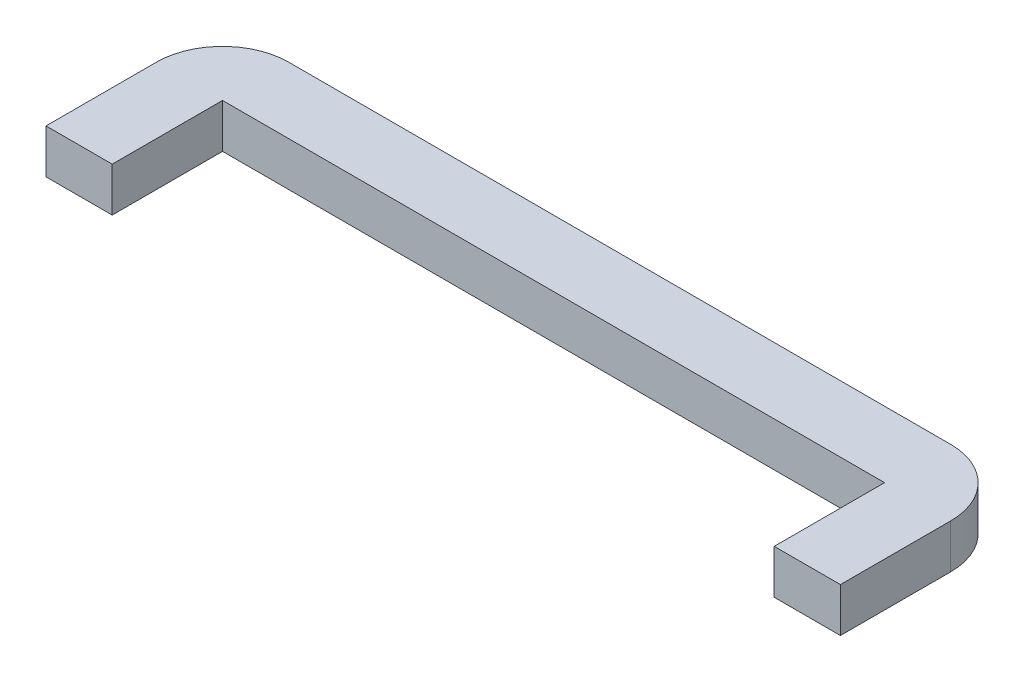
ISO-10303-21;
HEADER;
FILE_DESCRIPTION(('STEP AP214'),'2;1');
FILE_NAME('part.step','',(''),(''),'','','');
FILE_SCHEMA(('AUTOMOTIVE_DESIGN { 1 0 10303 214 1 1 1 1 }'));
ENDSEC;
DATA;
#1=APPLICATION_CONTEXT('core data for automotive mechanical design processes');
#2=APPLICATION_PROTOCOL_DEFINITION('international standard','automotive_design',2000,#1);
#3=PRODUCT_CONTEXT('',#1,'mechanical');
#4=PRODUCT('Part','Part','',(#3));
#5=PRODUCT_RELATED_PRODUCT_CATEGORY('part','',(#4));
#6=PRODUCT_DEFINITION_FORMATION('','',#4);
#7=PRODUCT_DEFINITION_CONTEXT('part definition',#1,'design');
#8=PRODUCT_DEFINITION('design','',#6,#7);
#9=PRODUCT_DEFINITION_SHAPE('','',#8);
#10=(LENGTH_UNIT() NAMED_UNIT(*) SI_UNIT(.MILLI.,.METRE.));
#11=(NAMED_UNIT(*) PLANE_ANGLE_UNIT() SI_UNIT($,.RADIAN.));
#12=(NAMED_UNIT(*) SI_UNIT($,.STERADIAN.) SOLID_ANGLE_UNIT());
#13=UNCERTAINTY_MEASURE_WITH_UNIT(LENGTH_MEASURE(1.E-05),#10,'distance_accuracy_value','');
#14=(GEOMETRIC_REPRESENTATION_CONTEXT(3) GLOBAL_UNCERTAINTY_ASSIGNED_CONTEXT((#13)) GLOBAL_UNIT_ASSIGNED_CONTEXT((#10,
#11,#12)) REPRESENTATION_CONTEXT('',''));
#15=CARTESIAN_POINT('',(0.,0.,0.));
#16=DIRECTION('',(0.,0.,1.));
#17=DIRECTION('',(1.,0.,0.));
#18=AXIS2_PLACEMENT_3D('',#15,#16,#17);
#19=CARTESIAN_POINT('',(0.,1.,1.5));
#20=DIRECTION('',(0.,0.,-1.));
#21=DIRECTION('',(-1.,0.,0.));
#22=AXIS2_PLACEMENT_3D('',#19,#20,#21);
#23=PLANE('',#22);
#24=DIRECTION('',(1.,0.,0.));
#25=VECTOR('',#24,1.);
#26=CARTESIAN_POINT('',(0.,-1.,1.5));
#27=LINE('',#26,#25);
#28=CARTESIAN_POINT('',(-15.,-1.,1.5));
#29=VERTEX_POINT('',#28);
#30=CARTESIAN_POINT('',(15.,-1.,1.5));
#31=VERTEX_POINT('',#30);
#32=EDGE_CURVE('E134',#29,#31,#27,.T.);
#33=ORIENTED_EDGE('',*,*,#32,.T.);
#34=DIRECTION('',(0.,-1.,0.));
#35=VECTOR('',#34,1.);
#36=CARTESIAN_POINT('',(15.,1.,1.5));
#37=LINE('',#36,#35);
#38=CARTESIAN_POINT('',(15.,1.,1.5));
#39=VERTEX_POINT('',#38);
#40=EDGE_CURVE('E117',#39,#31,#37,.T.);
#41=ORIENTED_EDGE('',*,*,#40,.F.);
#42=DIRECTION('',(1.,0.,0.));
#43=VECTOR('',#42,1.);
#44=CARTESIAN_POINT('',(0.,1.,1.5));
#45=LINE('',#44,#43);
#46=CARTESIAN_POINT('',(-15.,1.,1.5));
#47=VERTEX_POINT('',#46);
#48=EDGE_CURVE('E123',#47,#39,#45,.T.);
#49=ORIENTED_EDGE('',*,*,#48,.F.);
#50=DIRECTION('',(0.,-1.,0.));
#51=VECTOR('',#50,1.);
#52=CARTESIAN_POINT('',(-15.,1.,1.5));
#53=LINE('',#52,#51);
#54=EDGE_CURVE('E191',#47,#29,#53,.T.);
#55=ORIENTED_EDGE('',*,*,#54,.T.);
#56=EDGE_LOOP('',(#33,#41,#49,#55));
#57=FACE_BOUND('',#56,.T.);
#58=ADVANCED_FACE('F34',(#57),#23,.F.);
#59=CARTESIAN_POINT('',(15.,1.,0.));
#60=DIRECTION('',(1.,0.,0.));
#61=DIRECTION('',(0.,0.,-1.));
#62=AXIS2_PLACEMENT_3D('',#59,#60,#61);
#63=PLANE('',#62);
#64=DIRECTION('',(0.,0.,1.));
#65=VECTOR('',#64,1.);
#66=CARTESIAN_POINT('',(15.,-1.,0.));
#67=LINE('',#66,#65);
#68=CARTESIAN_POINT('',(15.,-1.,6.5));
#69=VERTEX_POINT('',#68);
#70=EDGE_CURVE('E202',#31,#69,#67,.T.);
#71=ORIENTED_EDGE('',*,*,#70,.T.);
#72=DIRECTION('',(0.,-1.,0.));
#73=VECTOR('',#72,1.);
#74=CARTESIAN_POINT('',(15.,1.,6.5));
#75=LINE('',#74,#73);
#76=CARTESIAN_POINT('',(15.,1.,6.5));
#77=VERTEX_POINT('',#76);
#78=EDGE_CURVE('E119',#77,#69,#75,.T.);
#79=ORIENTED_EDGE('',*,*,#78,.F.);
#80=DIRECTION('',(0.,0.,1.));
#81=VECTOR('',#80,1.);
#82=CARTESIAN_POINT('',(15.,1.,0.));
#83=LINE('',#82,#81);
#84=EDGE_CURVE('E112',#39,#77,#83,.T.);
#85=ORIENTED_EDGE('',*,*,#84,.F.);
#86=ORIENTED_EDGE('',*,*,#40,.T.);
#87=EDGE_LOOP('',(#71,#79,#85,#86));
#88=FACE_BOUND('',#87,.T.);
#89=ADVANCED_FACE('F115',(#88),#63,.F.);
#90=CARTESIAN_POINT('',(0.,1.,6.49999999999998));
#91=DIRECTION('',(0.,0.,1.));
#92=DIRECTION('',(1.,0.,0.));
#93=AXIS2_PLACEMENT_3D('',#90,#91,#92);
#94=PLANE('',#93);
#95=DIRECTION('',(-1.,0.,0.));
#96=VECTOR('',#95,1.);
#97=CARTESIAN_POINT('',(0.,-1.,6.49999999999998));
#98=LINE('',#97,#96);
#99=CARTESIAN_POINT('',(18.,-1.,6.5));
#100=VERTEX_POINT('',#99);
#101=EDGE_CURVE('E183',#100,#69,#98,.T.);
#102=ORIENTED_EDGE('',*,*,#101,.F.);
#103=DIRECTION('',(0.,-1.,0.));
#104=VECTOR('',#103,1.);
#105=CARTESIAN_POINT('',(18.,1.,6.5));
#106=LINE('',#105,#104);
#107=CARTESIAN_POINT('',(18.,1.,6.5));
#108=VERTEX_POINT('',#107);
#109=EDGE_CURVE('E140',#108,#100,#106,.T.);
#110=ORIENTED_EDGE('',*,*,#109,.F.);
#111=DIRECTION('',(-1.,0.,0.));
#112=VECTOR('',#111,1.);
#113=CARTESIAN_POINT('',(0.,1.,6.49999999999998));
#114=LINE('',#113,#112);
#115=EDGE_CURVE('E122',#108,#77,#114,.T.);
#116=ORIENTED_EDGE('',*,*,#115,.T.);
#117=ORIENTED_EDGE('',*,*,#78,.T.);
#118=EDGE_LOOP('',(#102,#110,#116,#117));
#119=FACE_BOUND('',#118,.T.);
#120=ADVANCED_FACE('F201',(#119),#94,.T.);
#121=CARTESIAN_POINT('',(18.,1.,0.));
#122=DIRECTION('',(-1.,0.,0.));
#123=DIRECTION('',(0.,0.,1.));
#124=AXIS2_PLACEMENT_3D('',#121,#122,#123);
#125=PLANE('',#124);
#126=DIRECTION('',(0.,0.,-1.));
#127=VECTOR('',#126,1.);
#128=CARTESIAN_POINT('',(18.,-1.,0.));
#129=LINE('',#128,#127);
#130=CARTESIAN_POINT('',(18.,-1.,1.5));
#131=VERTEX_POINT('',#130);
#132=EDGE_CURVE('E179',#100,#131,#129,.T.);
#133=ORIENTED_EDGE('',*,*,#132,.T.);
#134=DIRECTION('',(0.,-1.,0.));
#135=VECTOR('',#134,1.);
#136=CARTESIAN_POINT('',(18.,1.,1.5));
#137=LINE('',#136,#135);
#138=CARTESIAN_POINT('',(18.,1.,1.5));
#139=VERTEX_POINT('',#138);
#140=EDGE_CURVE('E11',#131,#139,#137,.F.);
#141=ORIENTED_EDGE('',*,*,#140,.T.);
#142=DIRECTION('',(0.,0.,-1.));
#143=VECTOR('',#142,1.);
#144=CARTESIAN_POINT('',(18.,1.,0.));
#145=LINE('',#144,#143);
#146=EDGE_CURVE('E197',#108,#139,#145,.T.);
#147=ORIENTED_EDGE('',*,*,#146,.F.);
#148=ORIENTED_EDGE('',*,*,#109,.T.);
#149=EDGE_LOOP('',(#133,#141,#147,#148));
#150=FACE_BOUND('',#149,.T.);
#151=ADVANCED_FACE('F196',(#150),#125,.F.);
#152=CARTESIAN_POINT('',(0.,1.,-1.5));
#153=DIRECTION('',(0.,0.,-1.));
#154=DIRECTION('',(-1.,0.,0.));
#155=AXIS2_PLACEMENT_3D('',#152,#153,#154);
#156=PLANE('',#155);
#157=DIRECTION('',(1.,0.,0.));
#158=VECTOR('',#157,1.);
#159=CARTESIAN_POINT('',(0.,-1.,-1.5));
#160=LINE('',#159,#158);
#161=CARTESIAN_POINT('',(-15.,-1.,-1.5));
#162=VERTEX_POINT('',#161);
#163=CARTESIAN_POINT('',(15.,-1.,-1.5));
#164=VERTEX_POINT('',#163);
#165=EDGE_CURVE('E173',#162,#164,#160,.T.);
#166=ORIENTED_EDGE('',*,*,#165,.F.);
#167=DIRECTION('',(0.,-1.,0.));
#168=VECTOR('',#167,1.);
#169=CARTESIAN_POINT('',(-15.,1.,-1.5));
#170=LINE('',#169,#168);
#171=CARTESIAN_POINT('',(-15.,1.,-1.5));
#172=VERTEX_POINT('',#171);
#173=EDGE_CURVE('E150',#162,#172,#170,.F.);
#174=ORIENTED_EDGE('',*,*,#173,.T.);
#175=DIRECTION('',(1.,0.,0.));
#176=VECTOR('',#175,1.);
#177=CARTESIAN_POINT('',(0.,1.,-1.5));
#178=LINE('',#177,#176);
#179=CARTESIAN_POINT('',(15.,1.,-1.5));
#180=VERTEX_POINT('',#179);
#181=EDGE_CURVE('E156',#172,#180,#178,.T.);
#182=ORIENTED_EDGE('',*,*,#181,.T.);
#183=DIRECTION('',(0.,-1.,0.));
#184=VECTOR('',#183,1.);
#185=CARTESIAN_POINT('',(15.,-1.,-1.5));
#186=LINE('',#185,#184);
#187=EDGE_CURVE('E147',#180,#164,#186,.T.);
#188=ORIENTED_EDGE('',*,*,#187,.T.);
#189=EDGE_LOOP('',(#166,#174,#182,#188));
#190=FACE_BOUND('',#189,.T.);
#191=ADVANCED_FACE('F177',(#190),#156,.T.);
#192=CARTESIAN_POINT('',(-18.,1.,0.));
#193=DIRECTION('',(-1.,0.,0.));
#194=DIRECTION('',(0.,0.,1.));
#195=AXIS2_PLACEMENT_3D('',#192,#193,#194);
#196=PLANE('',#195);
#197=DIRECTION('',(0.,0.,-1.));
#198=VECTOR('',#197,1.);
#199=CARTESIAN_POINT('',(-18.,1.,0.));
#200=LINE('',#199,#198);
#201=CARTESIAN_POINT('',(-18.,1.,6.5));
#202=VERTEX_POINT('',#201);
#203=CARTESIAN_POINT('',(-18.,1.,1.5));
#204=VERTEX_POINT('',#203);
#205=EDGE_CURVE('E155',#202,#204,#200,.T.);
#206=ORIENTED_EDGE('',*,*,#205,.T.);
#207=DIRECTION('',(0.,-1.,0.));
#208=VECTOR('',#207,1.);
#209=CARTESIAN_POINT('',(-18.,1.,1.5));
#210=LINE('',#209,#208);
#211=CARTESIAN_POINT('',(-18.,-1.,1.5));
#212=VERTEX_POINT('',#211);
#213=EDGE_CURVE('E135',#204,#212,#210,.T.);
#214=ORIENTED_EDGE('',*,*,#213,.T.);
#215=DIRECTION('',(0.,0.,-1.));
#216=VECTOR('',#215,1.);
#217=CARTESIAN_POINT('',(-18.,-1.,0.));
#218=LINE('',#217,#216);
#219=CARTESIAN_POINT('',(-18.,-1.,6.5));
#220=VERTEX_POINT('',#219);
#221=EDGE_CURVE('E175',#220,#212,#218,.T.);
#222=ORIENTED_EDGE('',*,*,#221,.F.);
#223=DIRECTION('',(0.,-1.,0.));
#224=VECTOR('',#223,1.);
#225=CARTESIAN_POINT('',(-18.,1.,6.5));
#226=LINE('',#225,#224);
#227=EDGE_CURVE('E164',#202,#220,#226,.T.);
#228=ORIENTED_EDGE('',*,*,#227,.F.);
#229=EDGE_LOOP('',(#206,#214,#222,#228));
#230=FACE_BOUND('',#229,.T.);
#231=ADVANCED_FACE('F161',(#230),#196,.T.);
#232=CARTESIAN_POINT('',(0.,1.,6.5));
#233=DIRECTION('',(0.,0.,-1.));
#234=DIRECTION('',(-1.,0.,0.));
#235=AXIS2_PLACEMENT_3D('',#232,#233,#234);
#236=PLANE('',#235);
#237=DIRECTION('',(1.,0.,0.));
#238=VECTOR('',#237,1.);
#239=CARTESIAN_POINT('',(0.,-1.,6.5));
#240=LINE('',#239,#238);
#241=CARTESIAN_POINT('',(-15.,-1.,6.5));
#242=VERTEX_POINT('',#241);
#243=EDGE_CURVE('E181',#220,#242,#240,.T.);
#244=ORIENTED_EDGE('',*,*,#243,.T.);
#245=DIRECTION('',(0.,-1.,0.));
#246=VECTOR('',#245,1.);
#247=CARTESIAN_POINT('',(-15.,1.,6.5));
#248=LINE('',#247,#246);
#249=CARTESIAN_POINT('',(-15.,1.,6.5));
#250=VERTEX_POINT('',#249);
#251=EDGE_CURVE('E193',#250,#242,#248,.T.);
#252=ORIENTED_EDGE('',*,*,#251,.F.);
#253=DIRECTION('',(1.,0.,0.));
#254=VECTOR('',#253,1.);
#255=CARTESIAN_POINT('',(0.,1.,6.5));
#256=LINE('',#255,#254);
#257=EDGE_CURVE('E166',#202,#250,#256,.T.);
#258=ORIENTED_EDGE('',*,*,#257,.F.);
#259=ORIENTED_EDGE('',*,*,#227,.T.);
#260=EDGE_LOOP('',(#244,#252,#258,#259));
#261=FACE_BOUND('',#260,.T.);
#262=ADVANCED_FACE('F230',(#261),#236,.F.);
#263=CARTESIAN_POINT('',(-15.,1.,0.));
#264=DIRECTION('',(1.,0.,0.));
#265=DIRECTION('',(0.,0.,-1.));
#266=AXIS2_PLACEMENT_3D('',#263,#264,#265);
#267=PLANE('',#266);
#268=DIRECTION('',(0.,0.,1.));
#269=VECTOR('',#268,1.);
#270=CARTESIAN_POINT('',(-15.,-1.,0.));
#271=LINE('',#270,#269);
#272=EDGE_CURVE('E131',#29,#242,#271,.T.);
#273=ORIENTED_EDGE('',*,*,#272,.F.);
#274=ORIENTED_EDGE('',*,*,#54,.F.);
#275=DIRECTION('',(0.,0.,1.));
#276=VECTOR('',#275,1.);
#277=CARTESIAN_POINT('',(-15.,1.,0.));
#278=LINE('',#277,#276);
#279=EDGE_CURVE('E129',#47,#250,#278,.T.);
#280=ORIENTED_EDGE('',*,*,#279,.T.);
#281=ORIENTED_EDGE('',*,*,#251,.T.);
#282=EDGE_LOOP('',(#273,#274,#280,#281));
#283=FACE_BOUND('',#282,.T.);
#284=ADVANCED_FACE('F233',(#283),#267,.T.);
#285=CARTESIAN_POINT('',(0.,1.,0.));
#286=DIRECTION('',(0.,1.,0.));
#287=DIRECTION('',(0.,0.,1.));
#288=AXIS2_PLACEMENT_3D('',#285,#286,#287);
#289=PLANE('',#288);
#290=ORIENTED_EDGE('',*,*,#181,.F.);
#291=CARTESIAN_POINT('',(-15.,1.,1.5));
#292=DIRECTION('',(0.,1.,0.));
#293=DIRECTION('',(0.,0.,1.));
#294=AXIS2_PLACEMENT_3D('',#291,#292,#293);
#295=CIRCLE('',#294,3.);
#296=EDGE_CURVE('E42',#172,#204,#295,.T.);
#297=ORIENTED_EDGE('',*,*,#296,.T.);
#298=ORIENTED_EDGE('',*,*,#205,.F.);
#299=ORIENTED_EDGE('',*,*,#257,.T.);
#300=ORIENTED_EDGE('',*,*,#279,.F.);
#301=ORIENTED_EDGE('',*,*,#48,.T.);
#302=ORIENTED_EDGE('',*,*,#84,.T.);
#303=ORIENTED_EDGE('',*,*,#115,.F.);
#304=ORIENTED_EDGE('',*,*,#146,.T.);
#305=CARTESIAN_POINT('',(15.,1.,1.5));
#306=DIRECTION('',(0.,1.,0.));
#307=DIRECTION('',(0.,0.,1.));
#308=AXIS2_PLACEMENT_3D('',#305,#306,#307);
#309=CIRCLE('',#308,3.);
#310=EDGE_CURVE('E54',#139,#180,#309,.T.);
#311=ORIENTED_EDGE('',*,*,#310,.T.);
#312=EDGE_LOOP('',(#290,#297,#298,#299,#300,#301,#302,#303,#304,#311));
#313=FACE_BOUND('',#312,.T.);
#314=ADVANCED_FACE('F127',(#313),#289,.T.);
#315=CARTESIAN_POINT('',(0.,-1.,0.));
#316=DIRECTION('',(0.,1.,0.));
#317=DIRECTION('',(0.,0.,1.));
#318=AXIS2_PLACEMENT_3D('',#315,#316,#317);
#319=PLANE('',#318);
#320=ORIENTED_EDGE('',*,*,#221,.T.);
#321=CARTESIAN_POINT('',(-15.,-1.,1.5));
#322=DIRECTION('',(0.,1.,0.));
#323=DIRECTION('',(0.,0.,1.));
#324=AXIS2_PLACEMENT_3D('',#321,#322,#323);
#325=CIRCLE('',#324,3.);
#326=EDGE_CURVE('E145',#212,#162,#325,.F.);
#327=ORIENTED_EDGE('',*,*,#326,.T.);
#328=ORIENTED_EDGE('',*,*,#165,.T.);
#329=CARTESIAN_POINT('',(15.,-1.,1.5));
#330=DIRECTION('',(0.,1.,0.));
#331=DIRECTION('',(0.,0.,1.));
#332=AXIS2_PLACEMENT_3D('',#329,#330,#331);
#333=CIRCLE('',#332,3.);
#334=EDGE_CURVE('E138',#164,#131,#333,.F.);
#335=ORIENTED_EDGE('',*,*,#334,.T.);
#336=ORIENTED_EDGE('',*,*,#132,.F.);
#337=ORIENTED_EDGE('',*,*,#101,.T.);
#338=ORIENTED_EDGE('',*,*,#70,.F.);
#339=ORIENTED_EDGE('',*,*,#32,.F.);
#340=ORIENTED_EDGE('',*,*,#272,.T.);
#341=ORIENTED_EDGE('',*,*,#243,.F.);
#342=EDGE_LOOP('',(#320,#327,#328,#335,#336,#337,#338,#339,#340,#341));
#343=FACE_BOUND('',#342,.T.);
#344=ADVANCED_FACE('F172',(#343),#319,.F.);
#345=CARTESIAN_POINT('',(-15.,1.,1.5));
#346=DIRECTION('',(0.,-1.,0.));
#347=DIRECTION('',(0.,0.,-1.));
#348=AXIS2_PLACEMENT_3D('',#345,#346,#347);
#349=CYLINDRICAL_SURFACE('',#348,3.);
#350=ORIENTED_EDGE('',*,*,#296,.F.);
#351=ORIENTED_EDGE('',*,*,#173,.F.);
#352=ORIENTED_EDGE('',*,*,#326,.F.);
#353=ORIENTED_EDGE('',*,*,#213,.F.);
#354=EDGE_LOOP('',(#350,#351,#352,#353));
#355=FACE_BOUND('',#354,.T.);
#356=ADVANCED_FACE('F168',(#355),#349,.T.);
#357=CARTESIAN_POINT('',(15.,1.,1.5));
#358=DIRECTION('',(0.,1.,0.));
#359=DIRECTION('',(0.,0.,1.));
#360=AXIS2_PLACEMENT_3D('',#357,#358,#359);
#361=CYLINDRICAL_SURFACE('',#360,3.);
#362=ORIENTED_EDGE('',*,*,#310,.F.);
#363=ORIENTED_EDGE('',*,*,#140,.F.);
#364=ORIENTED_EDGE('',*,*,#334,.F.);
#365=ORIENTED_EDGE('',*,*,#187,.F.);
#366=EDGE_LOOP('',(#362,#363,#364,#365));
#367=FACE_BOUND('',#366,.T.);
#368=ADVANCED_FACE('F36',(#367),#361,.T.);
#369=CLOSED_SHELL('',(#58,#89,#120,#151,#191,#231,#262,#284,#314,#344,#356,#368));
#370=MANIFOLD_SOLID_BREP('B2',#369);
#371=ADVANCED_BREP_SHAPE_REPRESENTATION('',(#18,#370),#14);
#372=SHAPE_DEFINITION_REPRESENTATION(#9,#371);
ENDSEC;
END-ISO-10303-21;
